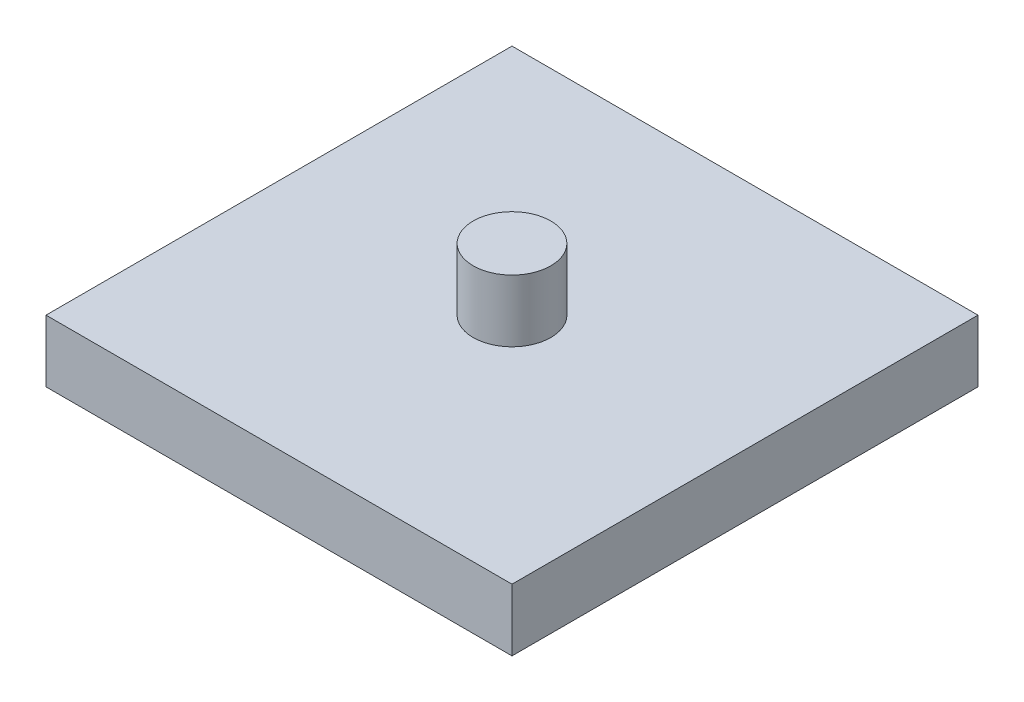
ISO-10303-21;
HEADER;
FILE_DESCRIPTION(('STEP AP214'),'2;1');
FILE_NAME('part.step','',(''),(''),'','','');
FILE_SCHEMA(('AUTOMOTIVE_DESIGN { 1 0 10303 214 1 1 1 1 }'));
ENDSEC;
DATA;
#1=APPLICATION_CONTEXT('core data for automotive mechanical design processes');
#2=APPLICATION_PROTOCOL_DEFINITION('international standard','automotive_design',2000,#1);
#3=PRODUCT_CONTEXT('',#1,'mechanical');
#4=PRODUCT('Part','Part','',(#3));
#5=PRODUCT_RELATED_PRODUCT_CATEGORY('part','',(#4));
#6=PRODUCT_DEFINITION_FORMATION('','',#4);
#7=PRODUCT_DEFINITION_CONTEXT('part definition',#1,'design');
#8=PRODUCT_DEFINITION('design','',#6,#7);
#9=PRODUCT_DEFINITION_SHAPE('','',#8);
#10=(LENGTH_UNIT() NAMED_UNIT(*) SI_UNIT(.MILLI.,.METRE.));
#11=(NAMED_UNIT(*) PLANE_ANGLE_UNIT() SI_UNIT($,.RADIAN.));
#12=(NAMED_UNIT(*) SI_UNIT($,.STERADIAN.) SOLID_ANGLE_UNIT());
#13=UNCERTAINTY_MEASURE_WITH_UNIT(LENGTH_MEASURE(1.E-05),#10,'distance_accuracy_value','');
#14=(GEOMETRIC_REPRESENTATION_CONTEXT(3) GLOBAL_UNCERTAINTY_ASSIGNED_CONTEXT((#13)) GLOBAL_UNIT_ASSIGNED_CONTEXT((#10,
#11,#12)) REPRESENTATION_CONTEXT('',''));
#15=CARTESIAN_POINT('',(0.,0.,0.));
#16=DIRECTION('',(0.,0.,1.));
#17=DIRECTION('',(1.,0.,0.));
#18=AXIS2_PLACEMENT_3D('',#15,#16,#17);
#19=CARTESIAN_POINT('',(150.,40.,-150.));
#20=DIRECTION('',(-1.,0.,0.));
#21=DIRECTION('',(0.,0.,1.));
#22=AXIS2_PLACEMENT_3D('',#19,#20,#21);
#23=PLANE('',#22);
#24=DIRECTION('',(0.,0.,-1.));
#25=VECTOR('',#24,1.);
#26=CARTESIAN_POINT('',(150.,0.,-150.));
#27=LINE('',#26,#25);
#28=CARTESIAN_POINT('',(150.,0.,150.));
#29=VERTEX_POINT('',#28);
#30=CARTESIAN_POINT('',(150.,0.,-150.));
#31=VERTEX_POINT('',#30);
#32=EDGE_CURVE('E95',#29,#31,#27,.T.);
#33=ORIENTED_EDGE('',*,*,#32,.T.);
#34=DIRECTION('',(0.,-1.,0.));
#35=VECTOR('',#34,1.);
#36=CARTESIAN_POINT('',(150.,40.,-150.));
#37=LINE('',#36,#35);
#38=CARTESIAN_POINT('',(150.,40.,-150.));
#39=VERTEX_POINT('',#38);
#40=EDGE_CURVE('E11',#39,#31,#37,.T.);
#41=ORIENTED_EDGE('',*,*,#40,.F.);
#42=DIRECTION('',(0.,0.,-1.));
#43=VECTOR('',#42,1.);
#44=CARTESIAN_POINT('',(150.,40.,-150.));
#45=LINE('',#44,#43);
#46=CARTESIAN_POINT('',(150.,40.,150.));
#47=VERTEX_POINT('',#46);
#48=EDGE_CURVE('E83',#47,#39,#45,.T.);
#49=ORIENTED_EDGE('',*,*,#48,.F.);
#50=DIRECTION('',(0.,-1.,0.));
#51=VECTOR('',#50,1.);
#52=CARTESIAN_POINT('',(150.,40.,150.));
#53=LINE('',#52,#51);
#54=EDGE_CURVE('E91',#47,#29,#53,.T.);
#55=ORIENTED_EDGE('',*,*,#54,.T.);
#56=EDGE_LOOP('',(#33,#41,#49,#55));
#57=FACE_BOUND('',#56,.T.);
#58=ADVANCED_FACE('F32',(#57),#23,.F.);
#59=CARTESIAN_POINT('',(-150.,40.,-150.));
#60=DIRECTION('',(0.,0.,1.));
#61=DIRECTION('',(1.,0.,0.));
#62=AXIS2_PLACEMENT_3D('',#59,#60,#61);
#63=PLANE('',#62);
#64=DIRECTION('',(-1.,0.,0.));
#65=VECTOR('',#64,1.);
#66=CARTESIAN_POINT('',(-150.,0.,-150.));
#67=LINE('',#66,#65);
#68=CARTESIAN_POINT('',(-150.,0.,-150.));
#69=VERTEX_POINT('',#68);
#70=EDGE_CURVE('E87',#31,#69,#67,.T.);
#71=ORIENTED_EDGE('',*,*,#70,.T.);
#72=DIRECTION('',(0.,-1.,0.));
#73=VECTOR('',#72,1.);
#74=CARTESIAN_POINT('',(-150.,40.,-150.));
#75=LINE('',#74,#73);
#76=CARTESIAN_POINT('',(-150.,40.,-150.));
#77=VERTEX_POINT('',#76);
#78=EDGE_CURVE('E40',#77,#69,#75,.T.);
#79=ORIENTED_EDGE('',*,*,#78,.F.);
#80=DIRECTION('',(-1.,0.,0.));
#81=VECTOR('',#80,1.);
#82=CARTESIAN_POINT('',(-150.,40.,-150.));
#83=LINE('',#82,#81);
#84=EDGE_CURVE('E78',#39,#77,#83,.T.);
#85=ORIENTED_EDGE('',*,*,#84,.F.);
#86=ORIENTED_EDGE('',*,*,#40,.T.);
#87=EDGE_LOOP('',(#71,#79,#85,#86));
#88=FACE_BOUND('',#87,.T.);
#89=ADVANCED_FACE('F86',(#88),#63,.F.);
#90=CARTESIAN_POINT('',(-150.,40.,-150.));
#91=DIRECTION('',(1.,0.,0.));
#92=DIRECTION('',(0.,0.,-1.));
#93=AXIS2_PLACEMENT_3D('',#90,#91,#92);
#94=PLANE('',#93);
#95=DIRECTION('',(0.,0.,1.));
#96=VECTOR('',#95,1.);
#97=CARTESIAN_POINT('',(-150.,0.,-150.));
#98=LINE('',#97,#96);
#99=CARTESIAN_POINT('',(-150.,0.,150.));
#100=VERTEX_POINT('',#99);
#101=EDGE_CURVE('E65',#69,#100,#98,.T.);
#102=ORIENTED_EDGE('',*,*,#101,.T.);
#103=DIRECTION('',(0.,-1.,0.));
#104=VECTOR('',#103,1.);
#105=CARTESIAN_POINT('',(-150.,40.,150.));
#106=LINE('',#105,#104);
#107=CARTESIAN_POINT('',(-150.,40.,150.));
#108=VERTEX_POINT('',#107);
#109=EDGE_CURVE('E88',#108,#100,#106,.T.);
#110=ORIENTED_EDGE('',*,*,#109,.F.);
#111=DIRECTION('',(0.,0.,1.));
#112=VECTOR('',#111,1.);
#113=CARTESIAN_POINT('',(-150.,40.,-150.));
#114=LINE('',#113,#112);
#115=EDGE_CURVE('E81',#77,#108,#114,.T.);
#116=ORIENTED_EDGE('',*,*,#115,.F.);
#117=ORIENTED_EDGE('',*,*,#78,.T.);
#118=EDGE_LOOP('',(#102,#110,#116,#117));
#119=FACE_BOUND('',#118,.T.);
#120=ADVANCED_FACE('F89',(#119),#94,.F.);
#121=CARTESIAN_POINT('',(-150.,40.,150.));
#122=DIRECTION('',(0.,0.,-1.));
#123=DIRECTION('',(-1.,0.,0.));
#124=AXIS2_PLACEMENT_3D('',#121,#122,#123);
#125=PLANE('',#124);
#126=DIRECTION('',(1.,0.,0.));
#127=VECTOR('',#126,1.);
#128=CARTESIAN_POINT('',(-150.,0.,150.));
#129=LINE('',#128,#127);
#130=EDGE_CURVE('E71',#100,#29,#129,.T.);
#131=ORIENTED_EDGE('',*,*,#130,.T.);
#132=ORIENTED_EDGE('',*,*,#54,.F.);
#133=DIRECTION('',(1.,0.,0.));
#134=VECTOR('',#133,1.);
#135=CARTESIAN_POINT('',(-150.,40.,150.));
#136=LINE('',#135,#134);
#137=EDGE_CURVE('E48',#108,#47,#136,.T.);
#138=ORIENTED_EDGE('',*,*,#137,.F.);
#139=ORIENTED_EDGE('',*,*,#109,.T.);
#140=EDGE_LOOP('',(#131,#132,#138,#139));
#141=FACE_BOUND('',#140,.T.);
#142=ADVANCED_FACE('F103',(#141),#125,.F.);
#143=CARTESIAN_POINT('',(0.,40.,0.));
#144=DIRECTION('',(0.,1.,0.));
#145=DIRECTION('',(0.,0.,1.));
#146=AXIS2_PLACEMENT_3D('',#143,#144,#145);
#147=PLANE('',#146);
#148=CARTESIAN_POINT('',(0.,40.,0.));
#149=DIRECTION('',(0.,1.,0.));
#150=DIRECTION('',(0.,0.,1.));
#151=AXIS2_PLACEMENT_3D('',#148,#149,#150);
#152=CIRCLE('',#151,25.);
#153=CARTESIAN_POINT('',(0.,40.,25.));
#154=VERTEX_POINT('',#153);
#155=EDGE_CURVE('E109',#154,#154,#152,.T.);
#156=ORIENTED_EDGE('',*,*,#155,.F.);
#157=EDGE_LOOP('',(#156));
#158=FACE_BOUND('',#157,.T.);
#159=ORIENTED_EDGE('',*,*,#48,.T.);
#160=ORIENTED_EDGE('',*,*,#84,.T.);
#161=ORIENTED_EDGE('',*,*,#115,.T.);
#162=ORIENTED_EDGE('',*,*,#137,.T.);
#163=EDGE_LOOP('',(#159,#160,#161,#162));
#164=FACE_BOUND('',#163,.T.);
#165=ADVANCED_FACE('F79',(#158,#164),#147,.T.);
#166=CARTESIAN_POINT('',(0.,0.,0.));
#167=DIRECTION('',(0.,1.,0.));
#168=DIRECTION('',(0.,0.,1.));
#169=AXIS2_PLACEMENT_3D('',#166,#167,#168);
#170=PLANE('',#169);
#171=ORIENTED_EDGE('',*,*,#32,.F.);
#172=ORIENTED_EDGE('',*,*,#130,.F.);
#173=ORIENTED_EDGE('',*,*,#101,.F.);
#174=ORIENTED_EDGE('',*,*,#70,.F.);
#175=EDGE_LOOP('',(#171,#172,#173,#174));
#176=FACE_BOUND('',#175,.T.);
#177=ADVANCED_FACE('F106',(#176),#170,.F.);
#178=CARTESIAN_POINT('',(0.,80.,0.));
#179=DIRECTION('',(0.,-1.,0.));
#180=DIRECTION('',(0.,0.,-1.));
#181=AXIS2_PLACEMENT_3D('',#178,#179,#180);
#182=CYLINDRICAL_SURFACE('',#181,25.);
#183=CARTESIAN_POINT('',(0.,80.,0.));
#184=DIRECTION('',(0.,1.,0.));
#185=DIRECTION('',(0.,0.,1.));
#186=AXIS2_PLACEMENT_3D('',#183,#184,#185);
#187=CIRCLE('',#186,25.);
#188=CARTESIAN_POINT('',(0.,80.,25.));
#189=VERTEX_POINT('',#188);
#190=EDGE_CURVE('E98',#189,#189,#187,.T.);
#191=ORIENTED_EDGE('',*,*,#190,.F.);
#192=EDGE_LOOP('',(#191));
#193=FACE_BOUND('',#192,.T.);
#194=ORIENTED_EDGE('',*,*,#155,.T.);
#195=EDGE_LOOP('',(#194));
#196=FACE_BOUND('',#195,.T.);
#197=ADVANCED_FACE('F117',(#193,#196),#182,.T.);
#198=CARTESIAN_POINT('',(0.,80.,0.));
#199=DIRECTION('',(0.,1.,0.));
#200=DIRECTION('',(0.,0.,1.));
#201=AXIS2_PLACEMENT_3D('',#198,#199,#200);
#202=PLANE('',#201);
#203=ORIENTED_EDGE('',*,*,#190,.T.);
#204=EDGE_LOOP('',(#203));
#205=FACE_BOUND('',#204,.T.);
#206=ADVANCED_FACE('F115',(#205),#202,.T.);
#207=CLOSED_SHELL('',(#58,#89,#120,#142,#165,#177,#197,#206));
#208=MANIFOLD_SOLID_BREP('B2',#207);
#209=ADVANCED_BREP_SHAPE_REPRESENTATION('',(#18,#208),#14);
#210=SHAPE_DEFINITION_REPRESENTATION(#9,#209);
ENDSEC;
END-ISO-10303-21;
